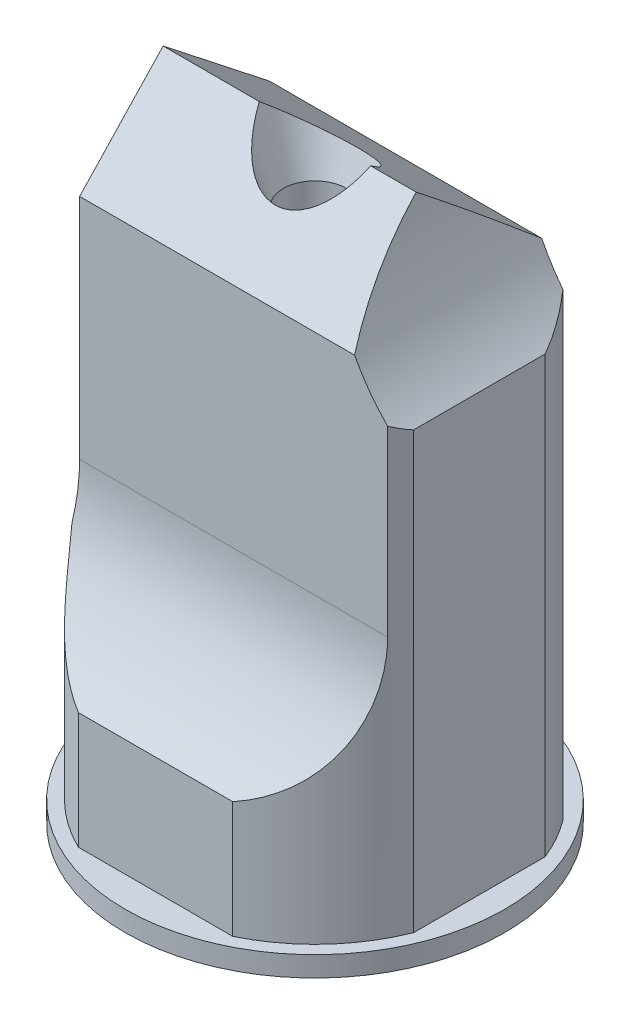
ISO-10303-21;
HEADER;
FILE_DESCRIPTION(('STEP AP214'),'2;1');
FILE_NAME('part.step','',(''),(''),'','','');
FILE_SCHEMA(('AUTOMOTIVE_DESIGN { 1 0 10303 214 1 1 1 1 }'));
ENDSEC;
DATA;
#1=APPLICATION_CONTEXT('core data for automotive mechanical design processes');
#2=APPLICATION_PROTOCOL_DEFINITION('international standard','automotive_design',2000,#1);
#3=PRODUCT_CONTEXT('',#1,'mechanical');
#4=PRODUCT('Part','Part','',(#3));
#5=PRODUCT_RELATED_PRODUCT_CATEGORY('part','',(#4));
#6=PRODUCT_DEFINITION_FORMATION('','',#4);
#7=PRODUCT_DEFINITION_CONTEXT('part definition',#1,'design');
#8=PRODUCT_DEFINITION('design','',#6,#7);
#9=PRODUCT_DEFINITION_SHAPE('','',#8);
#10=(LENGTH_UNIT() NAMED_UNIT(*) SI_UNIT(.MILLI.,.METRE.));
#11=(NAMED_UNIT(*) PLANE_ANGLE_UNIT() SI_UNIT($,.RADIAN.));
#12=(NAMED_UNIT(*) SI_UNIT($,.STERADIAN.) SOLID_ANGLE_UNIT());
#13=UNCERTAINTY_MEASURE_WITH_UNIT(LENGTH_MEASURE(1.E-05),#10,'distance_accuracy_value','');
#14=(GEOMETRIC_REPRESENTATION_CONTEXT(3) GLOBAL_UNCERTAINTY_ASSIGNED_CONTEXT((#13)) GLOBAL_UNIT_ASSIGNED_CONTEXT((#10,
#11,#12)) REPRESENTATION_CONTEXT('',''));
#15=CARTESIAN_POINT('',(0.,0.,0.));
#16=DIRECTION('',(0.,0.,1.));
#17=DIRECTION('',(1.,0.,0.));
#18=AXIS2_PLACEMENT_3D('',#15,#16,#17);
#19=CARTESIAN_POINT('',(0.,23.6,0.));
#20=DIRECTION('',(0.,-1.,0.));
#21=DIRECTION('',(0.,0.,-1.));
#22=AXIS2_PLACEMENT_3D('',#19,#20,#21);
#23=CYLINDRICAL_SURFACE('',#22,1.25);
#24=CARTESIAN_POINT('',(0.,21.1,0.));
#25=DIRECTION('',(0.,-1.,0.));
#26=DIRECTION('',(0.,0.,-1.));
#27=AXIS2_PLACEMENT_3D('',#24,#25,#26);
#28=CIRCLE('',#27,1.25);
#29=CARTESIAN_POINT('',(0.,21.1,-1.25));
#30=VERTEX_POINT('',#29);
#31=EDGE_CURVE('E141',#30,#30,#28,.T.);
#32=ORIENTED_EDGE('',*,*,#31,.F.);
#33=EDGE_LOOP('',(#32));
#34=FACE_BOUND('',#33,.T.);
#35=CARTESIAN_POINT('',(0.,20.,0.));
#36=DIRECTION('',(0.,-1.,0.));
#37=DIRECTION('',(0.,0.,-1.));
#38=AXIS2_PLACEMENT_3D('',#35,#36,#37);
#39=CIRCLE('',#38,1.25);
#40=CARTESIAN_POINT('',(0.,20.,-1.25));
#41=VERTEX_POINT('',#40);
#42=EDGE_CURVE('E507',#41,#41,#39,.F.);
#43=ORIENTED_EDGE('',*,*,#42,.F.);
#44=EDGE_LOOP('',(#43));
#45=FACE_BOUND('',#44,.T.);
#46=ADVANCED_FACE('F37',(#34,#45),#23,.F.);
#47=CARTESIAN_POINT('',(0.,23.6,0.));
#48=DIRECTION('',(0.,-1.,0.));
#49=DIRECTION('',(0.,0.,-1.));
#50=AXIS2_PLACEMENT_3D('',#47,#48,#49);
#51=CYLINDRICAL_SURFACE('',#50,7.5);
#52=CARTESIAN_POINT('',(0.,0.,0.));
#53=DIRECTION('',(0.,1.,0.));
#54=DIRECTION('',(0.,0.,1.));
#55=AXIS2_PLACEMENT_3D('',#52,#53,#54);
#56=CIRCLE('',#55,7.5);
#57=CARTESIAN_POINT('',(0.,0.,7.5));
#58=VERTEX_POINT('',#57);
#59=EDGE_CURVE('E198',#58,#58,#56,.T.);
#60=ORIENTED_EDGE('',*,*,#59,.T.);
#61=EDGE_LOOP('',(#60));
#62=FACE_BOUND('',#61,.T.);
#63=CARTESIAN_POINT('',(0.,0.799999999999999,0.));
#64=DIRECTION('',(0.,1.,0.));
#65=DIRECTION('',(0.,0.,1.));
#66=AXIS2_PLACEMENT_3D('',#63,#64,#65);
#67=CIRCLE('',#66,7.5);
#68=CARTESIAN_POINT('',(0.,0.799999999999999,7.5));
#69=VERTEX_POINT('',#68);
#70=EDGE_CURVE('E185',#69,#69,#67,.F.);
#71=ORIENTED_EDGE('',*,*,#70,.T.);
#72=EDGE_LOOP('',(#71));
#73=FACE_BOUND('',#72,.T.);
#74=ADVANCED_FACE('F302',(#62,#73),#51,.T.);
#75=CARTESIAN_POINT('',(0.,0.,0.));
#76=DIRECTION('',(0.,1.,0.));
#77=DIRECTION('',(0.,0.,1.));
#78=AXIS2_PLACEMENT_3D('',#75,#76,#77);
#79=PLANE('',#78);
#80=CARTESIAN_POINT('',(0.,0.,0.));
#81=DIRECTION('',(0.,-1.,0.));
#82=DIRECTION('',(0.,0.,-1.));
#83=AXIS2_PLACEMENT_3D('',#80,#81,#82);
#84=CIRCLE('',#83,3.5);
#85=CARTESIAN_POINT('',(0.,0.,-3.5));
#86=VERTEX_POINT('',#85);
#87=EDGE_CURVE('E230',#86,#86,#84,.T.);
#88=ORIENTED_EDGE('',*,*,#87,.F.);
#89=EDGE_LOOP('',(#88));
#90=FACE_BOUND('',#89,.T.);
#91=ORIENTED_EDGE('',*,*,#59,.F.);
#92=EDGE_LOOP('',(#91));
#93=FACE_BOUND('',#92,.T.);
#94=ADVANCED_FACE('F298',(#90,#93),#79,.F.);
#95=CARTESIAN_POINT('',(0.,-21.2132034355964,3.26995375221628E-13));
#96=DIRECTION('',(0.,1.,0.));
#97=DIRECTION('',(0.,0.,1.));
#98=AXIS2_PLACEMENT_3D('',#95,#96,#97);
#99=CYLINDRICAL_SURFACE('',#98,7.00000000000027);
#100=CARTESIAN_POINT('',(-6.00000000000031,9.07152203321233,3.60555127546431));
#101=CARTESIAN_POINT('',(-5.9732832703672,8.92717658648891,3.64996502824974));
#102=CARTESIAN_POINT('',(-5.94316794802458,8.78486328504646,3.69900658354545));
#103=CARTESIAN_POINT('',(-5.87550497606515,8.50521668607768,3.80559003309033));
#104=CARTESIAN_POINT('',(-5.83795461258003,8.36788522869835,3.86313502923343));
#105=CARTESIAN_POINT('',(-5.7547853266757,8.09916130858148,3.98596559922591));
#106=CARTESIAN_POINT('',(-5.70916258606911,7.96777169338959,4.0512548312154));
#107=CARTESIAN_POINT('',(-5.60924764537704,7.71197526484742,4.18850183100707));
#108=CARTESIAN_POINT('',(-5.5549567450682,7.58756740836757,4.26045859834526));
#109=CARTESIAN_POINT('',(-5.43695023848542,7.3461861314879,4.41006508414087));
#110=CARTESIAN_POINT('',(-5.37320205103479,7.22924049428825,4.48773399546219));
#111=CARTESIAN_POINT('',(-5.23601916481869,7.00406897389102,4.64705802234901));
#112=CARTESIAN_POINT('',(-5.16258478739676,6.89584280161318,4.72871300561825));
#113=CARTESIAN_POINT('',(-5.00591121431785,6.6888568851322,4.89426413721598));
#114=CARTESIAN_POINT('',(-4.92268311718156,6.59008665115106,4.97815766693035));
#115=CARTESIAN_POINT('',(-4.7463971256556,6.40229783696107,5.14650959986144));
#116=CARTESIAN_POINT('',(-4.65334009969557,6.31327839663954,5.23096795255693));
#117=CARTESIAN_POINT('',(-4.46233378113032,6.14914541085112,5.39468624118897));
#118=CARTESIAN_POINT('',(-4.36482696948955,6.07357213059372,5.47400251428793));
#119=CARTESIAN_POINT('',(-4.16159680859804,5.93134036828198,5.63005519266159));
#120=CARTESIAN_POINT('',(-4.05587353325706,5.86468180605152,5.70679162113394));
#121=CARTESIAN_POINT('',(-3.83692348063718,5.74008231728783,5.85624237970831));
#122=CARTESIAN_POINT('',(-3.72370385205945,5.68213325285405,5.92896042378153));
#123=CARTESIAN_POINT('',(-3.49042179625485,5.57448813537244,6.06922240300908));
#124=CARTESIAN_POINT('',(-3.37036306482026,5.52478768062276,6.13676908731922));
#125=CARTESIAN_POINT('',(-3.21500867558894,5.46693480889637,6.21812286466628));
#126=CARTESIAN_POINT('',(-3.18251235638193,5.45517702764428,6.23481817025495));
#127=CARTESIAN_POINT('',(-3.11715252537278,5.4321953529148,6.26775046117872));
#128=CARTESIAN_POINT('',(-3.08428947575823,5.42097086452828,6.28398794859242));
#129=CARTESIAN_POINT('',(-3.05122926047972,5.40999999999996,6.30000000000003));
#130=B_SPLINE_CURVE_WITH_KNOTS('',3,(#100,#101,#102,#103,#104,#105,#106,#107,#108,#109,#110,
#111,#112,#113,#114,#115,#116,#117,#118,#119,#120,#121,#122,#123,#124,#125,#126,#127,#128,#129),
.UNSPECIFIED.,.F.,.F.,(4,2,2,2,2,2,2,2,2,2,2,2,2,2,4),(0.,0.460017090063792,0.920202401781091,
1.38060596319238,1.84094055255316,2.30289953639338,2.76484319839718,3.22626832472744,
3.68765271614229,4.12711669992158,4.56657673103677,5.00562355605169,5.44443533411234,
5.55956919832619,5.67457145627714),.UNSPECIFIED.);
#131=CARTESIAN_POINT('',(-6.00000000000031,9.07152203321233,3.60555127546432));
#132=VERTEX_POINT('',#131);
#133=CARTESIAN_POINT('',(-3.0512292604785,5.41,6.30000000000002));
#134=VERTEX_POINT('',#133);
#135=EDGE_CURVE('E154',#132,#134,#130,.T.);
#136=ORIENTED_EDGE('',*,*,#135,.F.);
#137=DIRECTION('',(0.,1.,0.));
#138=VECTOR('',#137,1.);
#139=CARTESIAN_POINT('',(-6.00000000000031,-21.2132034355964,3.60555127546432));
#140=LINE('',#139,#138);
#141=CARTESIAN_POINT('',(-6.00000000000031,0.799999999999999,3.60555127546432));
#142=VERTEX_POINT('',#141);
#143=EDGE_CURVE('E152',#142,#132,#140,.T.);
#144=ORIENTED_EDGE('',*,*,#143,.F.);
#145=CARTESIAN_POINT('',(0.,0.799999999999999,3.26995375221628E-13));
#146=DIRECTION('',(0.,1.,0.));
#147=DIRECTION('',(0.,0.,1.));
#148=AXIS2_PLACEMENT_3D('',#145,#146,#147);
#149=CIRCLE('',#148,7.00000000000027);
#150=CARTESIAN_POINT('',(-3.0512292604785,0.799999999999999,6.30000000000061));
#151=VERTEX_POINT('',#150);
#152=EDGE_CURVE('E148',#151,#142,#149,.F.);
#153=ORIENTED_EDGE('',*,*,#152,.F.);
#154=DIRECTION('',(0.,1.,0.));
#155=VECTOR('',#154,1.);
#156=CARTESIAN_POINT('',(-3.0512292604785,-21.2132034355964,6.30000000000061));
#157=LINE('',#156,#155);
#158=EDGE_CURVE('E164',#151,#134,#157,.T.);
#159=ORIENTED_EDGE('',*,*,#158,.T.);
#160=EDGE_LOOP('',(#136,#144,#153,#159));
#161=FACE_BOUND('',#160,.T.);
#162=ADVANCED_FACE('F236',(#161),#99,.T.);
#163=CARTESIAN_POINT('',(6.0621215793443E-13,-21.2132034355964,6.30000000000032));
#164=DIRECTION('',(0.,0.,1.));
#165=DIRECTION('',(1.,0.,0.));
#166=AXIS2_PLACEMENT_3D('',#163,#164,#165);
#167=PLANE('',#166);
#168=DIRECTION('',(1.,0.,0.));
#169=VECTOR('',#168,1.);
#170=CARTESIAN_POINT('',(-7.5,5.41,6.30000000000002));
#171=LINE('',#170,#169);
#172=CARTESIAN_POINT('',(3.05122926047821,5.41,6.30000000000002));
#173=VERTEX_POINT('',#172);
#174=EDGE_CURVE('E229',#134,#173,#171,.T.);
#175=ORIENTED_EDGE('',*,*,#174,.F.);
#176=ORIENTED_EDGE('',*,*,#158,.F.);
#177=DIRECTION('',(-1.,0.,0.));
#178=VECTOR('',#177,1.);
#179=CARTESIAN_POINT('',(6.0621215793443E-13,0.799999999999999,6.30000000000032));
#180=LINE('',#179,#178);
#181=CARTESIAN_POINT('',(3.05122926047823,0.799999999999999,6.30000000000002));
#182=VERTEX_POINT('',#181);
#183=EDGE_CURVE('E168',#182,#151,#180,.T.);
#184=ORIENTED_EDGE('',*,*,#183,.F.);
#185=DIRECTION('',(0.,1.,0.));
#186=VECTOR('',#185,1.);
#187=CARTESIAN_POINT('',(3.05122926047823,-21.2132034355964,6.30000000000003));
#188=LINE('',#187,#186);
#189=EDGE_CURVE('E169',#182,#173,#188,.T.);
#190=ORIENTED_EDGE('',*,*,#189,.T.);
#191=EDGE_LOOP('',(#175,#176,#184,#190));
#192=FACE_BOUND('',#191,.T.);
#193=ADVANCED_FACE('F291',(#192),#167,.T.);
#194=CARTESIAN_POINT('',(-1.32157156745855E-13,-21.2132034355964,-3.28730098697605E-13));
#195=DIRECTION('',(0.,1.,0.));
#196=DIRECTION('',(0.,0.,1.));
#197=AXIS2_PLACEMENT_3D('',#194,#195,#196);
#198=CYLINDRICAL_SURFACE('',#197,7.00000000000027);
#199=CARTESIAN_POINT('',(6.17332973362025,18.3201719844994,3.30000000000002));
#200=CARTESIAN_POINT('',(6.20297878218655,18.2902603605679,3.24453888811253));
#201=CARTESIAN_POINT('',(6.23210750646917,18.2613766578831,3.18824634423596));
#202=CARTESIAN_POINT('',(6.28915460097501,18.2056809599199,3.07418092288345));
#203=CARTESIAN_POINT('',(6.31707484334952,18.1788657058594,3.01641057315133));
#204=CARTESIAN_POINT('',(6.37163133021298,18.1272268397289,2.89939331483949));
#205=CARTESIAN_POINT('',(6.39826758162393,18.1024032169217,2.84014641422248));
#206=CARTESIAN_POINT('',(6.45018866099707,18.0546732871407,2.72017481903677));
#207=CARTESIAN_POINT('',(6.47547124175977,18.0317701346759,2.65944789667703));
#208=CARTESIAN_POINT('',(6.50000000000008,18.0098300562505,2.59807621135317));
#209=B_SPLINE_CURVE_WITH_KNOTS('',3,(#199,#200,#201,#202,#203,#204,#205,#206,#207,#208),
.UNSPECIFIED.,.F.,.F.,(4,2,2,2,4),(0.,0.208903802806084,0.41747146023483,0.626037993148959,
0.834940661223692),.UNSPECIFIED.);
#210=CARTESIAN_POINT('',(6.17332973362025,18.3201719844994,3.30000000000002));
#211=VERTEX_POINT('',#210);
#212=CARTESIAN_POINT('',(6.50000000000009,18.0098300562505,2.59807621135317));
#213=VERTEX_POINT('',#212);
#214=EDGE_CURVE('E126',#211,#213,#209,.T.);
#215=ORIENTED_EDGE('',*,*,#214,.F.);
#216=DIRECTION('',(0.,1.,0.));
#217=VECTOR('',#216,1.);
#218=CARTESIAN_POINT('',(6.17332973362025,-21.2132034355964,3.30000000000002));
#219=LINE('',#218,#217);
#220=CARTESIAN_POINT('',(6.17332973362025,11.1020997883031,3.30000000000002));
#221=VERTEX_POINT('',#220);
#222=EDGE_CURVE('E138',#221,#211,#219,.T.);
#223=ORIENTED_EDGE('',*,*,#222,.F.);
#224=CARTESIAN_POINT('',(3.05122926047823,5.40999999999999,6.30000000000002));
#225=CARTESIAN_POINT('',(3.18104179439707,5.45305866866994,6.23717043159703));
#226=CARTESIAN_POINT('',(3.30783794777384,5.50007343030343,6.17076833475012));
#227=CARTESIAN_POINT('',(3.55460284679042,5.60255160794579,6.03197341696037));
#228=CARTESIAN_POINT('',(3.67456954120333,5.65801754406493,5.95957881202375));
#229=CARTESIAN_POINT('',(3.9066553680252,5.77783357281709,5.81008680832447));
#230=CARTESIAN_POINT('',(4.01878423916429,5.84217233400195,5.73299547673503));
#231=CARTESIAN_POINT('',(4.23463399826378,5.98013167311077,5.57545655725122));
#232=CARTESIAN_POINT('',(4.33835621118505,6.05375078368067,5.49500950128668));
#233=CARTESIAN_POINT('',(4.53716788293389,6.21069618431592,5.33204329484375));
#234=CARTESIAN_POINT('',(4.63222895798551,6.29405248213011,5.24951838832477));
#235=CARTESIAN_POINT('',(4.81298983359163,6.47023045098653,5.08430191111134));
#236=CARTESIAN_POINT('',(4.89868907121507,6.56305269057148,5.00161033069887));
#237=CARTESIAN_POINT('',(5.06049125294181,6.75775051377652,4.83783717800482));
#238=CARTESIAN_POINT('',(5.13660523428356,6.85961545004597,4.75675384623674));
#239=CARTESIAN_POINT('',(5.27944684350618,7.07198042603698,4.59770279839547));
#240=CARTESIAN_POINT('',(5.3461747567543,7.18248020307211,4.51973498765184));
#241=CARTESIAN_POINT('',(5.46845862038383,7.40759049671577,4.37091827103763));
#242=CARTESIAN_POINT('',(5.52431414483382,7.52193895353973,4.29991832508636));
#243=CARTESIAN_POINT('',(5.62794977844689,7.75733635989767,4.16335582779017));
#244=CARTESIAN_POINT('',(5.6757299825563,7.87838523062869,4.09779321251995));
#245=CARTESIAN_POINT('',(5.76376753141515,8.12654376634267,3.97301199167654));
#246=CARTESIAN_POINT('',(5.80401556953133,8.2536606888086,3.91380127244335));
#247=CARTESIAN_POINT('',(5.87745645737246,8.5129916949335,3.80262350108751));
#248=CARTESIAN_POINT('',(5.91064917395406,8.64520587472892,3.75065658567149));
#249=CARTESIAN_POINT('',(5.97239603833674,8.92234860865712,3.65158966885799));
#250=CARTESIAN_POINT('',(6.00052766686657,9.06755405663283,3.60500066040724));
#251=CARTESIAN_POINT('',(6.05001707778706,9.36182135569386,3.5213147520243));
#252=CARTESIAN_POINT('',(6.07137381314949,9.51088379901356,3.48421931945115));
#253=CARTESIAN_POINT('',(6.10778133971251,9.8116882017217,3.41999531833358));
#254=CARTESIAN_POINT('',(6.12284015512635,9.96342649317921,3.3928540725692));
#255=CARTESIAN_POINT('',(6.14706293848645,10.2687861507087,3.34876873443287));
#256=CARTESIAN_POINT('',(6.1562294639632,10.4224066702592,3.3318202181438));
#257=CARTESIAN_POINT('',(6.16617068747807,10.6639611987357,3.31336564685424));
#258=CARTESIAN_POINT('',(6.16886020861328,10.7515669676051,3.30835103024824));
#259=CARTESIAN_POINT('',(6.17243707959966,10.9268124485451,3.30167024709813));
#260=CARTESIAN_POINT('',(6.17332710107548,11.0144519168013,3.29999911669054));
#261=CARTESIAN_POINT('',(6.17332973362025,11.1020997883031,3.30000000000002));
#262=B_SPLINE_CURVE_WITH_KNOTS('',3,(#224,#225,#226,#227,#228,#229,#230,#231,#232,#233,#234,
#235,#236,#237,#238,#239,#240,#241,#242,#243,#244,#245,#246,#247,#248,#249,#250,#251,#252,#253,
#254,#255,#256,#257,#258,#259,#260,#261),.UNSPECIFIED.,.F.,.F.,(4,2,2,2,2,2,2,2,2,2,2,2,2,2,2,2,
2,2,4),(0.,0.451437409296271,0.903009700042049,1.35401054006737,1.8049401597358,
2.25729804444229,2.70968311465535,3.16154241423409,3.61338797283803,4.05008330250957,
4.4867734973379,4.92399974825804,5.36123424948908,5.82594248396988,6.29072250199902,
6.75490852386319,7.21889293090904,7.48219042751863,7.74509673197828),.UNSPECIFIED.);
#263=EDGE_CURVE('E149',#173,#221,#262,.T.);
#264=ORIENTED_EDGE('',*,*,#263,.F.);
#265=ORIENTED_EDGE('',*,*,#189,.F.);
#266=CARTESIAN_POINT('',(-1.32157156745855E-13,0.799999999999999,-3.28730098697605E-13));
#267=DIRECTION('',(0.,1.,0.));
#268=DIRECTION('',(0.,0.,1.));
#269=AXIS2_PLACEMENT_3D('',#266,#267,#268);
#270=CIRCLE('',#269,7.00000000000027);
#271=CARTESIAN_POINT('',(6.50000000000008,0.799999999999999,2.59807621135317));
#272=VERTEX_POINT('',#271);
#273=EDGE_CURVE('E167',#272,#182,#270,.F.);
#274=ORIENTED_EDGE('',*,*,#273,.F.);
#275=DIRECTION('',(0.,1.,0.));
#276=VECTOR('',#275,1.);
#277=CARTESIAN_POINT('',(6.50000000000008,-21.2132034355964,2.59807621135317));
#278=LINE('',#277,#276);
#279=EDGE_CURVE('E140',#272,#213,#278,.T.);
#280=ORIENTED_EDGE('',*,*,#279,.T.);
#281=EDGE_LOOP('',(#215,#223,#264,#265,#274,#280));
#282=FACE_BOUND('',#281,.T.);
#283=ADVANCED_FACE('F136',(#282),#198,.T.);
#284=CARTESIAN_POINT('',(6.50000000000008,-21.2132034355964,0.));
#285=DIRECTION('',(1.,0.,0.));
#286=DIRECTION('',(0.,0.,-1.));
#287=AXIS2_PLACEMENT_3D('',#284,#285,#286);
#288=PLANE('',#287);
#289=DIRECTION('',(0.,0.,1.));
#290=VECTOR('',#289,1.);
#291=CARTESIAN_POINT('',(6.50000000000009,18.0098300562505,-7.5));
#292=LINE('',#291,#290);
#293=CARTESIAN_POINT('',(6.50000000000008,18.0098300562505,-2.59807621135383));
#294=VERTEX_POINT('',#293);
#295=EDGE_CURVE('E142',#213,#294,#292,.F.);
#296=ORIENTED_EDGE('',*,*,#295,.F.);
#297=ORIENTED_EDGE('',*,*,#279,.F.);
#298=DIRECTION('',(0.,0.,1.));
#299=VECTOR('',#298,1.);
#300=CARTESIAN_POINT('',(6.50000000000008,0.799999999999999,0.));
#301=LINE('',#300,#299);
#302=CARTESIAN_POINT('',(6.50000000000008,0.799999999999999,-2.59807621135383));
#303=VERTEX_POINT('',#302);
#304=EDGE_CURVE('E172',#303,#272,#301,.T.);
#305=ORIENTED_EDGE('',*,*,#304,.F.);
#306=DIRECTION('',(0.,1.,0.));
#307=VECTOR('',#306,1.);
#308=CARTESIAN_POINT('',(6.50000000000008,-21.2132034355964,-2.59807621135383));
#309=LINE('',#308,#307);
#310=EDGE_CURVE('E175',#303,#294,#309,.T.);
#311=ORIENTED_EDGE('',*,*,#310,.T.);
#312=EDGE_LOOP('',(#296,#297,#305,#311));
#313=FACE_BOUND('',#312,.T.);
#314=ADVANCED_FACE('F262',(#313),#288,.T.);
#315=CARTESIAN_POINT('',(0.,-21.2132034355964,0.));
#316=DIRECTION('',(0.,1.,0.));
#317=DIRECTION('',(0.,0.,1.));
#318=AXIS2_PLACEMENT_3D('',#315,#316,#317);
#319=CYLINDRICAL_SURFACE('',#318,7.00000000000027);
#320=CARTESIAN_POINT('',(6.50000000000008,18.0098300562505,-2.59807621135383));
#321=CARTESIAN_POINT('',(6.44860611977927,18.0558101835778,-2.72675059195417));
#322=CARTESIAN_POINT('',(6.39384745917459,18.1060516566196,-2.85257414760829));
#323=CARTESIAN_POINT('',(6.2786988936288,18.2153592244024,-3.09776775444908));
#324=CARTESIAN_POINT('',(6.21830490771445,18.274431733312,-3.21713302830834));
#325=CARTESIAN_POINT('',(6.09412668840865,18.4005559446356,-3.44650200405457));
#326=CARTESIAN_POINT('',(6.03041752289856,18.4674549658448,-3.55663033643182));
#327=CARTESIAN_POINT('',(5.90000604939769,18.6100711389047,-3.76900911860109));
#328=CARTESIAN_POINT('',(5.83330611274997,18.6857813778809,-3.87126564098438));
#329=CARTESIAN_POINT('',(5.73841890488363,18.7983346850479,-4.00910043542451));
#330=CARTESIAN_POINT('',(5.71090940829924,18.8315262747666,-4.04817867654845));
#331=CARTESIAN_POINT('',(5.65561548420035,18.8994580981924,-4.12507721579042));
#332=CARTESIAN_POINT('',(5.62783043221568,18.9342033328611,-4.16289264716308));
#333=CARTESIAN_POINT('',(5.60000000000048,18.9696652388834,-4.1999999999998));
#334=B_SPLINE_CURVE_WITH_KNOTS('',3,(#320,#321,#322,#323,#324,#325,#326,#327,#328,#329,#330,
#331,#332,#333),.UNSPECIFIED.,.F.,.F.,(4,2,2,2,2,2,4),(0.,0.437862621430204,0.876044830969583,
1.30677956800614,1.73717862008919,1.9117077679804,2.08684608500945),.UNSPECIFIED.);
#335=CARTESIAN_POINT('',(5.60000000000049,18.9696652388834,-4.1999999999998));
#336=VERTEX_POINT('',#335);
#337=EDGE_CURVE('E265',#294,#336,#334,.T.);
#338=ORIENTED_EDGE('',*,*,#337,.F.);
#339=ORIENTED_EDGE('',*,*,#310,.F.);
#340=CARTESIAN_POINT('',(0.,0.799999999999999,0.));
#341=DIRECTION('',(0.,1.,0.));
#342=DIRECTION('',(0.,0.,1.));
#343=AXIS2_PLACEMENT_3D('',#340,#341,#342);
#344=CIRCLE('',#343,7.00000000000027);
#345=CARTESIAN_POINT('',(5.60000000000048,0.799999999999999,-4.1999999999998));
#346=VERTEX_POINT('',#345);
#347=EDGE_CURVE('E174',#346,#303,#344,.F.);
#348=ORIENTED_EDGE('',*,*,#347,.F.);
#349=DIRECTION('',(0.,1.,0.));
#350=VECTOR('',#349,1.);
#351=CARTESIAN_POINT('',(5.60000000000048,-21.2132034355964,-4.1999999999998));
#352=LINE('',#351,#350);
#353=EDGE_CURVE('E178',#346,#336,#352,.T.);
#354=ORIENTED_EDGE('',*,*,#353,.T.);
#355=EDGE_LOOP('',(#338,#339,#348,#354));
#356=FACE_BOUND('',#355,.T.);
#357=ADVANCED_FACE('F257',(#356),#319,.T.);
#358=CARTESIAN_POINT('',(0.,-21.2132034355964,-4.1999999999998));
#359=DIRECTION('',(0.,0.,1.));
#360=DIRECTION('',(1.,0.,0.));
#361=AXIS2_PLACEMENT_3D('',#358,#359,#360);
#362=PLANE('',#361);
#363=DIRECTION('',(1.,0.,0.));
#364=VECTOR('',#363,1.);
#365=CARTESIAN_POINT('',(-7.5,20.3,-4.1999999999998));
#366=LINE('',#365,#364);
#367=CARTESIAN_POINT('',(-6.00000000000031,20.3,-4.1999999999998));
#368=VERTEX_POINT('',#367);
#369=CARTESIAN_POINT('',(4.76501670380699,20.3,-4.1999999999998));
#370=VERTEX_POINT('',#369);
#371=EDGE_CURVE('E218',#368,#370,#366,.T.);
#372=ORIENTED_EDGE('',*,*,#371,.T.);
#373=CARTESIAN_POINT('',(11.5000000000001,23.6,-4.1999999999998));
#374=DIRECTION('',(0.,0.,1.));
#375=DIRECTION('',(1.,0.,0.));
#376=AXIS2_PLACEMENT_3D('',#373,#374,#375);
#377=CIRCLE('',#376,7.5);
#378=EDGE_CURVE('E273',#370,#336,#377,.T.);
#379=ORIENTED_EDGE('',*,*,#378,.T.);
#380=ORIENTED_EDGE('',*,*,#353,.F.);
#381=DIRECTION('',(-1.,0.,0.));
#382=VECTOR('',#381,1.);
#383=CARTESIAN_POINT('',(0.,0.799999999999999,-4.1999999999998));
#384=LINE('',#383,#382);
#385=CARTESIAN_POINT('',(-6.00000000000031,0.799999999999992,-4.1999999999998));
#386=VERTEX_POINT('',#385);
#387=EDGE_CURVE('E196',#346,#386,#384,.T.);
#388=ORIENTED_EDGE('',*,*,#387,.T.);
#389=DIRECTION('',(0.,1.,0.));
#390=VECTOR('',#389,1.);
#391=CARTESIAN_POINT('',(-6.00000000000031,-21.2132034355964,-4.1999999999998));
#392=LINE('',#391,#390);
#393=EDGE_CURVE('E182',#386,#368,#392,.T.);
#394=ORIENTED_EDGE('',*,*,#393,.T.);
#395=EDGE_LOOP('',(#372,#379,#380,#388,#394));
#396=FACE_BOUND('',#395,.T.);
#397=ADVANCED_FACE('F253',(#396),#362,.F.);
#398=CARTESIAN_POINT('',(-6.00000000000031,-21.2132034355964,0.));
#399=DIRECTION('',(-1.,0.,0.));
#400=DIRECTION('',(0.,0.,1.));
#401=AXIS2_PLACEMENT_3D('',#398,#399,#400);
#402=PLANE('',#401);
#403=DIRECTION('',(0.,0.617821551931919,0.78631833882241));
#404=VECTOR('',#403,1.);
#405=CARTESIAN_POINT('',(-6.00000000000031,6.49464474540238,-21.7704521422142));
#406=LINE('',#405,#404);
#407=CARTESIAN_POINT('',(-6.00000000000031,23.6,0.));
#408=VERTEX_POINT('',#407);
#409=EDGE_CURVE('E211',#368,#408,#406,.T.);
#410=ORIENTED_EDGE('',*,*,#409,.F.);
#411=ORIENTED_EDGE('',*,*,#393,.F.);
#412=DIRECTION('',(0.,0.,-1.));
#413=VECTOR('',#412,1.);
#414=CARTESIAN_POINT('',(-6.00000000000031,0.799999999999999,0.));
#415=LINE('',#414,#413);
#416=EDGE_CURVE('E181',#142,#386,#415,.T.);
#417=ORIENTED_EDGE('',*,*,#416,.F.);
#418=ORIENTED_EDGE('',*,*,#143,.T.);
#419=CARTESIAN_POINT('',(-6.00000000000031,11.1020997883031,10.2));
#420=DIRECTION('',(-1.,0.,0.));
#421=DIRECTION('',(0.,0.,1.));
#422=AXIS2_PLACEMENT_3D('',#419,#420,#421);
#423=CIRCLE('',#422,6.9);
#424=CARTESIAN_POINT('',(-6.00000000000031,11.1020997883031,3.30000000000002));
#425=VERTEX_POINT('',#424);
#426=EDGE_CURVE('E205',#425,#132,#423,.T.);
#427=ORIENTED_EDGE('',*,*,#426,.F.);
#428=DIRECTION('',(0.,-1.,0.));
#429=VECTOR('',#428,1.);
#430=CARTESIAN_POINT('',(-6.00000000000031,-21.2132034355964,3.30000000000002));
#431=LINE('',#430,#429);
#432=CARTESIAN_POINT('',(-6.00000000000031,20.1020997883031,3.30000000000002));
#433=VERTEX_POINT('',#432);
#434=EDGE_CURVE('E207',#433,#425,#431,.T.);
#435=ORIENTED_EDGE('',*,*,#434,.F.);
#436=DIRECTION('',(0.,-0.727383880892037,0.686230784662448));
#437=VECTOR('',#436,1.);
#438=CARTESIAN_POINT('',(-6.00000000000031,-0.110097266358793,22.3686544051027));
#439=LINE('',#438,#437);
#440=EDGE_CURVE('E209',#408,#433,#439,.T.);
#441=ORIENTED_EDGE('',*,*,#440,.F.);
#442=EDGE_LOOP('',(#410,#411,#417,#418,#427,#435,#441));
#443=FACE_BOUND('',#442,.T.);
#444=ADVANCED_FACE('F248',(#443),#402,.T.);
#445=CARTESIAN_POINT('',(0.,0.8,0.));
#446=DIRECTION('',(0.,1.,0.));
#447=DIRECTION('',(0.,0.,1.));
#448=AXIS2_PLACEMENT_3D('',#445,#446,#447);
#449=PLANE('',#448);
#450=ORIENTED_EDGE('',*,*,#273,.T.);
#451=ORIENTED_EDGE('',*,*,#183,.T.);
#452=ORIENTED_EDGE('',*,*,#152,.T.);
#453=ORIENTED_EDGE('',*,*,#416,.T.);
#454=ORIENTED_EDGE('',*,*,#387,.F.);
#455=ORIENTED_EDGE('',*,*,#347,.T.);
#456=ORIENTED_EDGE('',*,*,#304,.T.);
#457=EDGE_LOOP('',(#450,#451,#452,#453,#454,#455,#456));
#458=FACE_BOUND('',#457,.T.);
#459=ORIENTED_EDGE('',*,*,#70,.F.);
#460=EDGE_LOOP('',(#459));
#461=FACE_BOUND('',#460,.T.);
#462=ADVANCED_FACE('F252',(#458,#461),#449,.T.);
#463=CARTESIAN_POINT('',(-7.5,23.6,0.));
#464=DIRECTION('',(0.,-0.78631833882241,0.617821551931919));
#465=DIRECTION('',(0.,-0.617821551931919,-0.78631833882241));
#466=AXIS2_PLACEMENT_3D('',#463,#464,#465);
#467=PLANE('',#466);
#468=DIRECTION('',(1.,0.,0.));
#469=VECTOR('',#468,1.);
#470=CARTESIAN_POINT('',(-7.5,23.6,0.));
#471=LINE('',#470,#469);
#472=CARTESIAN_POINT('',(2.2,23.6,0.));
#473=VERTEX_POINT('',#472);
#474=CARTESIAN_POINT('',(4.00000000000008,23.6,0.));
#475=VERTEX_POINT('',#474);
#476=EDGE_CURVE('E219',#473,#475,#471,.T.);
#477=ORIENTED_EDGE('',*,*,#476,.T.);
#478=CARTESIAN_POINT('',(11.5000000000001,23.6,0.));
#479=DIRECTION('',(0.,-0.78631833882241,0.617821551931919));
#480=DIRECTION('',(0.,0.617821551931919,0.78631833882241));
#481=AXIS2_PLACEMENT_3D('',#478,#479,#480);
#482=ELLIPSE('',#481,12.1394276009757,7.5);
#483=EDGE_CURVE('E353',#475,#370,#482,.T.);
#484=ORIENTED_EDGE('',*,*,#483,.T.);
#485=ORIENTED_EDGE('',*,*,#371,.F.);
#486=ORIENTED_EDGE('',*,*,#409,.T.);
#487=CARTESIAN_POINT('',(-2.2,23.6,0.));
#488=VERTEX_POINT('',#487);
#489=EDGE_CURVE('E214',#408,#488,#471,.T.);
#490=ORIENTED_EDGE('',*,*,#489,.T.);
#491=CARTESIAN_POINT('',(0.,24.1666126694136,0.721143397435499));
#492=DIRECTION('',(0.,-0.78631833882241,0.617821551931919));
#493=DIRECTION('',(0.,0.617821551931919,0.78631833882241));
#494=AXIS2_PLACEMENT_3D('',#491,#492,#493);
#495=ELLIPSE('',#494,3.07167300459295,2.30514385486671);
#496=EDGE_CURVE('E59',#488,#473,#495,.T.);
#497=ORIENTED_EDGE('',*,*,#496,.T.);
#498=EDGE_LOOP('',(#477,#484,#485,#486,#490,#497));
#499=FACE_BOUND('',#498,.T.);
#500=ADVANCED_FACE('F334',(#499),#467,.F.);
#501=CARTESIAN_POINT('',(-7.5,20.1020997883031,3.30000000000002));
#502=DIRECTION('',(0.,-0.686230784662448,-0.727383880892037));
#503=DIRECTION('',(0.,0.727383880892037,-0.686230784662448));
#504=AXIS2_PLACEMENT_3D('',#501,#502,#503);
#505=PLANE('',#504);
#506=DIRECTION('',(1.,0.,0.));
#507=VECTOR('',#506,1.);
#508=CARTESIAN_POINT('',(-7.5,20.1020997883031,3.30000000000002));
#509=LINE('',#508,#507);
#510=CARTESIAN_POINT('',(4.8656429016061,20.1020997883031,3.30000000000002));
#511=VERTEX_POINT('',#510);
#512=EDGE_CURVE('E225',#433,#511,#509,.T.);
#513=ORIENTED_EDGE('',*,*,#512,.T.);
#514=CARTESIAN_POINT('',(11.5000000000001,23.6,0.));
#515=DIRECTION('',(0.,-0.686230784662448,-0.727383880892037));
#516=DIRECTION('',(0.,-0.727383880892037,0.686230784662448));
#517=AXIS2_PLACEMENT_3D('',#514,#515,#516);
#518=ELLIPSE('',#517,10.3109241172657,7.5);
#519=EDGE_CURVE('E52',#511,#475,#518,.T.);
#520=ORIENTED_EDGE('',*,*,#519,.T.);
#521=ORIENTED_EDGE('',*,*,#476,.F.);
#522=CARTESIAN_POINT('',(0.,24.7211736288129,-1.05774114501898));
#523=DIRECTION('',(0.,-0.686230784662448,-0.727383880892037));
#524=DIRECTION('',(0.,0.727383880892037,-0.686230784662448));
#525=AXIS2_PLACEMENT_3D('',#522,#523,#524);
#526=ELLIPSE('',#525,3.82676795859666,2.40360170446095);
#527=EDGE_CURVE('E213',#473,#488,#526,.T.);
#528=ORIENTED_EDGE('',*,*,#527,.T.);
#529=ORIENTED_EDGE('',*,*,#489,.F.);
#530=ORIENTED_EDGE('',*,*,#440,.T.);
#531=EDGE_LOOP('',(#513,#520,#521,#528,#529,#530));
#532=FACE_BOUND('',#531,.T.);
#533=ADVANCED_FACE('F330',(#532),#505,.F.);
#534=CARTESIAN_POINT('',(-7.5,11.1020997883031,3.30000000000002));
#535=DIRECTION('',(0.,0.,-1.));
#536=DIRECTION('',(-1.,0.,0.));
#537=AXIS2_PLACEMENT_3D('',#534,#535,#536);
#538=PLANE('',#537);
#539=ORIENTED_EDGE('',*,*,#222,.T.);
#540=CARTESIAN_POINT('',(11.5000000000001,23.6,3.30000000000002));
#541=DIRECTION('',(0.,0.,1.));
#542=DIRECTION('',(1.,0.,0.));
#543=AXIS2_PLACEMENT_3D('',#540,#541,#542);
#544=CIRCLE('',#543,7.5);
#545=EDGE_CURVE('E123',#511,#211,#544,.T.);
#546=ORIENTED_EDGE('',*,*,#545,.F.);
#547=ORIENTED_EDGE('',*,*,#512,.F.);
#548=ORIENTED_EDGE('',*,*,#434,.T.);
#549=DIRECTION('',(1.,0.,0.));
#550=VECTOR('',#549,1.);
#551=CARTESIAN_POINT('',(-7.5,11.1020997883031,3.30000000000002));
#552=LINE('',#551,#550);
#553=EDGE_CURVE('E147',#425,#221,#552,.T.);
#554=ORIENTED_EDGE('',*,*,#553,.T.);
#555=EDGE_LOOP('',(#539,#546,#547,#548,#554));
#556=FACE_BOUND('',#555,.T.);
#557=ADVANCED_FACE('F145',(#556),#538,.F.);
#558=CARTESIAN_POINT('',(-7.5,11.1020997883031,10.2));
#559=DIRECTION('',(1.,0.,0.));
#560=DIRECTION('',(0.,0.,-1.));
#561=AXIS2_PLACEMENT_3D('',#558,#559,#560);
#562=CYLINDRICAL_SURFACE('',#561,6.9);
#563=ORIENTED_EDGE('',*,*,#263,.T.);
#564=ORIENTED_EDGE('',*,*,#553,.F.);
#565=ORIENTED_EDGE('',*,*,#426,.T.);
#566=ORIENTED_EDGE('',*,*,#135,.T.);
#567=ORIENTED_EDGE('',*,*,#174,.T.);
#568=EDGE_LOOP('',(#563,#564,#565,#566,#567));
#569=FACE_BOUND('',#568,.T.);
#570=ADVANCED_FACE('F240',(#569),#562,.F.);
#571=CARTESIAN_POINT('',(0.,4.,0.));
#572=DIRECTION('',(0.,-1.,0.));
#573=DIRECTION('',(0.,0.,-1.));
#574=AXIS2_PLACEMENT_3D('',#571,#572,#573);
#575=CYLINDRICAL_SURFACE('',#574,3.5);
#576=CARTESIAN_POINT('',(0.,5.00000000000002,0.));
#577=DIRECTION('',(0.,-1.,0.));
#578=DIRECTION('',(0.,0.,-1.));
#579=AXIS2_PLACEMENT_3D('',#576,#577,#578);
#580=CIRCLE('',#579,3.5);
#581=CARTESIAN_POINT('',(0.,5.00000000000002,-3.5));
#582=VERTEX_POINT('',#581);
#583=EDGE_CURVE('E13',#582,#582,#580,.F.);
#584=ORIENTED_EDGE('',*,*,#583,.T.);
#585=EDGE_LOOP('',(#584));
#586=FACE_BOUND('',#585,.T.);
#587=ORIENTED_EDGE('',*,*,#87,.T.);
#588=EDGE_LOOP('',(#587));
#589=FACE_BOUND('',#588,.T.);
#590=ADVANCED_FACE('F245',(#586,#589),#575,.F.);
#591=CARTESIAN_POINT('',(0.,20.,0.));
#592=DIRECTION('',(0.,-1.,0.));
#593=DIRECTION('',(0.,0.,-1.));
#594=AXIS2_PLACEMENT_3D('',#591,#592,#593);
#595=CYLINDRICAL_SURFACE('',#594,2.5);
#596=CARTESIAN_POINT('',(0.,6.00000000000003,0.));
#597=DIRECTION('',(0.,-1.,0.));
#598=DIRECTION('',(0.,0.,-1.));
#599=AXIS2_PLACEMENT_3D('',#596,#597,#598);
#600=CIRCLE('',#599,2.5);
#601=CARTESIAN_POINT('',(0.,6.00000000000003,-2.5));
#602=VERTEX_POINT('',#601);
#603=EDGE_CURVE('E45',#602,#602,#600,.T.);
#604=ORIENTED_EDGE('',*,*,#603,.T.);
#605=EDGE_LOOP('',(#604));
#606=FACE_BOUND('',#605,.T.);
#607=CARTESIAN_POINT('',(0.,20.,0.));
#608=DIRECTION('',(0.,-1.,0.));
#609=DIRECTION('',(0.,0.,-1.));
#610=AXIS2_PLACEMENT_3D('',#607,#608,#609);
#611=CIRCLE('',#610,2.5);
#612=CARTESIAN_POINT('',(0.,20.,-2.5));
#613=VERTEX_POINT('',#612);
#614=EDGE_CURVE('E505',#613,#613,#611,.T.);
#615=ORIENTED_EDGE('',*,*,#614,.F.);
#616=EDGE_LOOP('',(#615));
#617=FACE_BOUND('',#616,.T.);
#618=ADVANCED_FACE('F405',(#606,#617),#595,.F.);
#619=CARTESIAN_POINT('',(0.,20.,0.));
#620=DIRECTION('',(0.,-1.,0.));
#621=DIRECTION('',(0.,0.,-1.));
#622=AXIS2_PLACEMENT_3D('',#619,#620,#621);
#623=PLANE('',#622);
#624=ORIENTED_EDGE('',*,*,#42,.T.);
#625=EDGE_LOOP('',(#624));
#626=FACE_BOUND('',#625,.T.);
#627=ORIENTED_EDGE('',*,*,#614,.T.);
#628=EDGE_LOOP('',(#627));
#629=FACE_BOUND('',#628,.T.);
#630=ADVANCED_FACE('F413',(#626,#629),#623,.T.);
#631=CARTESIAN_POINT('',(0.,21.1,0.));
#632=DIRECTION('',(0.,1.,0.));
#633=DIRECTION('',(0.,0.,1.));
#634=AXIS2_PLACEMENT_3D('',#631,#632,#633);
#635=CONICAL_SURFACE('',#634,1.25,0.363147009946176);
#636=ORIENTED_EDGE('',*,*,#31,.T.);
#637=EDGE_LOOP('',(#636));
#638=FACE_BOUND('',#637,.T.);
#639=ORIENTED_EDGE('',*,*,#527,.F.);
#640=ORIENTED_EDGE('',*,*,#496,.F.);
#641=EDGE_LOOP('',(#639,#640));
#642=FACE_BOUND('',#641,.T.);
#643=ADVANCED_FACE('F278',(#638,#642),#635,.F.);
#644=CARTESIAN_POINT('',(11.5000000000001,23.6,-7.5));
#645=DIRECTION('',(0.,0.,1.));
#646=DIRECTION('',(1.,0.,0.));
#647=AXIS2_PLACEMENT_3D('',#644,#645,#646);
#648=CYLINDRICAL_SURFACE('',#647,7.5);
#649=ORIENTED_EDGE('',*,*,#214,.T.);
#650=ORIENTED_EDGE('',*,*,#295,.T.);
#651=ORIENTED_EDGE('',*,*,#337,.T.);
#652=ORIENTED_EDGE('',*,*,#378,.F.);
#653=ORIENTED_EDGE('',*,*,#483,.F.);
#654=ORIENTED_EDGE('',*,*,#519,.F.);
#655=ORIENTED_EDGE('',*,*,#545,.T.);
#656=EDGE_LOOP('',(#649,#650,#651,#652,#653,#654,#655));
#657=FACE_BOUND('',#656,.T.);
#658=ADVANCED_FACE('F125',(#657),#648,.F.);
#659=CARTESIAN_POINT('',(0.,6.00000000000003,0.));
#660=DIRECTION('',(0.,-1.,0.));
#661=DIRECTION('',(0.,0.,-1.));
#662=AXIS2_PLACEMENT_3D('',#659,#660,#661);
#663=CONICAL_SURFACE('',#662,2.5,0.785398163397443);
#664=ORIENTED_EDGE('',*,*,#583,.F.);
#665=EDGE_LOOP('',(#664));
#666=FACE_BOUND('',#665,.T.);
#667=ORIENTED_EDGE('',*,*,#603,.F.);
#668=EDGE_LOOP('',(#667));
#669=FACE_BOUND('',#668,.T.);
#670=ADVANCED_FACE('F39',(#666,#669),#663,.F.);
#671=CLOSED_SHELL('',(#46,#74,#94,#162,#193,#283,#314,#357,#397,#444,#462,#500,#533,#557,#570,
#590,#618,#630,#643,#658,#670));
#672=MANIFOLD_SOLID_BREP('B2',#671);
#673=ADVANCED_BREP_SHAPE_REPRESENTATION('',(#18,#672),#14);
#674=SHAPE_DEFINITION_REPRESENTATION(#9,#673);
ENDSEC;
END-ISO-10303-21;
